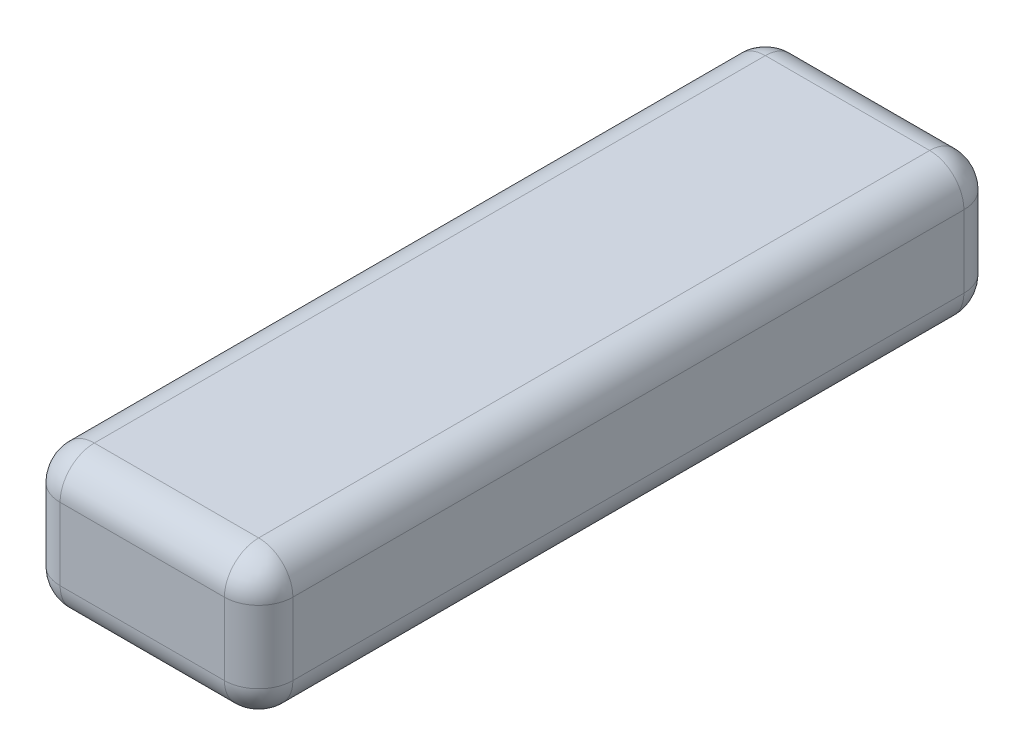
ISO-10303-21;
HEADER;
FILE_DESCRIPTION(('STEP AP214'),'2;1');
FILE_NAME('part.step','',(''),(''),'','','');
FILE_SCHEMA(('AUTOMOTIVE_DESIGN { 1 0 10303 214 1 1 1 1 }'));
ENDSEC;
DATA;
#1=APPLICATION_CONTEXT('core data for automotive mechanical design processes');
#2=APPLICATION_PROTOCOL_DEFINITION('international standard','automotive_design',2000,#1);
#3=PRODUCT_CONTEXT('',#1,'mechanical');
#4=PRODUCT('Part','Part','',(#3));
#5=PRODUCT_RELATED_PRODUCT_CATEGORY('part','',(#4));
#6=PRODUCT_DEFINITION_FORMATION('','',#4);
#7=PRODUCT_DEFINITION_CONTEXT('part definition',#1,'design');
#8=PRODUCT_DEFINITION('design','',#6,#7);
#9=PRODUCT_DEFINITION_SHAPE('','',#8);
#10=(LENGTH_UNIT() NAMED_UNIT(*) SI_UNIT(.MILLI.,.METRE.));
#11=(NAMED_UNIT(*) PLANE_ANGLE_UNIT() SI_UNIT($,.RADIAN.));
#12=(NAMED_UNIT(*) SI_UNIT($,.STERADIAN.) SOLID_ANGLE_UNIT());
#13=UNCERTAINTY_MEASURE_WITH_UNIT(LENGTH_MEASURE(1.E-05),#10,'distance_accuracy_value','');
#14=(GEOMETRIC_REPRESENTATION_CONTEXT(3) GLOBAL_UNCERTAINTY_ASSIGNED_CONTEXT((#13)) GLOBAL_UNIT_ASSIGNED_CONTEXT((#10,
#11,#12)) REPRESENTATION_CONTEXT('',''));
#15=CARTESIAN_POINT('',(0.,0.,0.));
#16=DIRECTION('',(0.,0.,1.));
#17=DIRECTION('',(1.,0.,0.));
#18=AXIS2_PLACEMENT_3D('',#15,#16,#17);
#19=CARTESIAN_POINT('',(17.,-10.05,54.));
#20=DIRECTION('',(1.,0.,0.));
#21=DIRECTION('',(0.,0.,-1.));
#22=AXIS2_PLACEMENT_3D('',#19,#20,#21);
#23=PLANE('',#22);
#24=DIRECTION('',(0.,1.,0.));
#25=VECTOR('',#24,1.);
#26=CARTESIAN_POINT('',(17.,-10.05,49.));
#27=LINE('',#26,#25);
#28=CARTESIAN_POINT('',(17.,5.5,49.));
#29=VERTEX_POINT('',#28);
#30=CARTESIAN_POINT('',(17.,-5.05,49.));
#31=VERTEX_POINT('',#30);
#32=EDGE_CURVE('E158',#29,#31,#27,.F.);
#33=ORIENTED_EDGE('',*,*,#32,.T.);
#34=DIRECTION('',(0.,0.,-1.));
#35=VECTOR('',#34,1.);
#36=CARTESIAN_POINT('',(17.,-5.05,54.));
#37=LINE('',#36,#35);
#38=CARTESIAN_POINT('',(17.,-5.05,-49.));
#39=VERTEX_POINT('',#38);
#40=EDGE_CURVE('E134',#31,#39,#37,.T.);
#41=ORIENTED_EDGE('',*,*,#40,.T.);
#42=DIRECTION('',(0.,1.,0.));
#43=VECTOR('',#42,1.);
#44=CARTESIAN_POINT('',(17.,-10.05,-49.));
#45=LINE('',#44,#43);
#46=CARTESIAN_POINT('',(17.,5.5,-49.));
#47=VERTEX_POINT('',#46);
#48=EDGE_CURVE('E155',#39,#47,#45,.T.);
#49=ORIENTED_EDGE('',*,*,#48,.T.);
#50=DIRECTION('',(0.,0.,-1.));
#51=VECTOR('',#50,1.);
#52=CARTESIAN_POINT('',(17.,5.5,49.));
#53=LINE('',#52,#51);
#54=EDGE_CURVE('E161',#47,#29,#53,.F.);
#55=ORIENTED_EDGE('',*,*,#54,.T.);
#56=EDGE_LOOP('',(#33,#41,#49,#55));
#57=FACE_BOUND('',#56,.T.);
#58=ADVANCED_FACE('F39',(#57),#23,.T.);
#59=CARTESIAN_POINT('',(-17.,-10.05,54.));
#60=DIRECTION('',(0.,0.,1.));
#61=DIRECTION('',(1.,0.,0.));
#62=AXIS2_PLACEMENT_3D('',#59,#60,#61);
#63=PLANE('',#62);
#64=DIRECTION('',(0.,1.,0.));
#65=VECTOR('',#64,1.);
#66=CARTESIAN_POINT('',(-12.,-10.05,54.));
#67=LINE('',#66,#65);
#68=CARTESIAN_POINT('',(-12.,5.5,54.));
#69=VERTEX_POINT('',#68);
#70=CARTESIAN_POINT('',(-12.,-5.05,54.));
#71=VERTEX_POINT('',#70);
#72=EDGE_CURVE('E183',#69,#71,#67,.F.);
#73=ORIENTED_EDGE('',*,*,#72,.T.);
#74=DIRECTION('',(1.,0.,0.));
#75=VECTOR('',#74,1.);
#76=CARTESIAN_POINT('',(-17.,-5.05,54.));
#77=LINE('',#76,#75);
#78=CARTESIAN_POINT('',(12.,-5.05,54.));
#79=VERTEX_POINT('',#78);
#80=EDGE_CURVE('E212',#71,#79,#77,.T.);
#81=ORIENTED_EDGE('',*,*,#80,.T.);
#82=DIRECTION('',(0.,1.,0.));
#83=VECTOR('',#82,1.);
#84=CARTESIAN_POINT('',(12.,-10.05,54.));
#85=LINE('',#84,#83);
#86=CARTESIAN_POINT('',(12.,5.5,54.));
#87=VERTEX_POINT('',#86);
#88=EDGE_CURVE('E180',#79,#87,#85,.T.);
#89=ORIENTED_EDGE('',*,*,#88,.T.);
#90=DIRECTION('',(1.,0.,0.));
#91=VECTOR('',#90,1.);
#92=CARTESIAN_POINT('',(-12.,5.5,54.));
#93=LINE('',#92,#91);
#94=EDGE_CURVE('E209',#87,#69,#93,.F.);
#95=ORIENTED_EDGE('',*,*,#94,.T.);
#96=EDGE_LOOP('',(#73,#81,#89,#95));
#97=FACE_BOUND('',#96,.T.);
#98=ADVANCED_FACE('F301',(#97),#63,.T.);
#99=CARTESIAN_POINT('',(-17.,-10.05,54.));
#100=DIRECTION('',(-1.,0.,0.));
#101=DIRECTION('',(0.,0.,1.));
#102=AXIS2_PLACEMENT_3D('',#99,#100,#101);
#103=PLANE('',#102);
#104=DIRECTION('',(0.,1.,0.));
#105=VECTOR('',#104,1.);
#106=CARTESIAN_POINT('',(-17.,-10.05,-49.));
#107=LINE('',#106,#105);
#108=CARTESIAN_POINT('',(-17.,5.5,-49.));
#109=VERTEX_POINT('',#108);
#110=CARTESIAN_POINT('',(-17.,-5.05,-49.));
#111=VERTEX_POINT('',#110);
#112=EDGE_CURVE('E177',#109,#111,#107,.F.);
#113=ORIENTED_EDGE('',*,*,#112,.T.);
#114=DIRECTION('',(0.,0.,1.));
#115=VECTOR('',#114,1.);
#116=CARTESIAN_POINT('',(-17.,-5.05,54.));
#117=LINE('',#116,#115);
#118=CARTESIAN_POINT('',(-17.,-5.05,49.));
#119=VERTEX_POINT('',#118);
#120=EDGE_CURVE('E203',#111,#119,#117,.T.);
#121=ORIENTED_EDGE('',*,*,#120,.T.);
#122=DIRECTION('',(0.,1.,0.));
#123=VECTOR('',#122,1.);
#124=CARTESIAN_POINT('',(-17.,-10.05,49.));
#125=LINE('',#124,#123);
#126=CARTESIAN_POINT('',(-17.,5.5,49.));
#127=VERTEX_POINT('',#126);
#128=EDGE_CURVE('E174',#119,#127,#125,.T.);
#129=ORIENTED_EDGE('',*,*,#128,.T.);
#130=DIRECTION('',(0.,0.,1.));
#131=VECTOR('',#130,1.);
#132=CARTESIAN_POINT('',(-17.,5.5,-49.));
#133=LINE('',#132,#131);
#134=EDGE_CURVE('E201',#127,#109,#133,.F.);
#135=ORIENTED_EDGE('',*,*,#134,.T.);
#136=EDGE_LOOP('',(#113,#121,#129,#135));
#137=FACE_BOUND('',#136,.T.);
#138=ADVANCED_FACE('F289',(#137),#103,.T.);
#139=CARTESIAN_POINT('',(-17.,-10.05,-54.));
#140=DIRECTION('',(0.,0.,-1.));
#141=DIRECTION('',(-1.,0.,0.));
#142=AXIS2_PLACEMENT_3D('',#139,#140,#141);
#143=PLANE('',#142);
#144=DIRECTION('',(0.,1.,0.));
#145=VECTOR('',#144,1.);
#146=CARTESIAN_POINT('',(12.,-10.05,-54.));
#147=LINE('',#146,#145);
#148=CARTESIAN_POINT('',(12.,5.5,-54.));
#149=VERTEX_POINT('',#148);
#150=CARTESIAN_POINT('',(12.,-5.05,-54.));
#151=VERTEX_POINT('',#150);
#152=EDGE_CURVE('E168',#149,#151,#147,.F.);
#153=ORIENTED_EDGE('',*,*,#152,.T.);
#154=DIRECTION('',(-1.,0.,0.));
#155=VECTOR('',#154,1.);
#156=CARTESIAN_POINT('',(-17.,-5.05,-54.));
#157=LINE('',#156,#155);
#158=CARTESIAN_POINT('',(-12.,-5.05,-54.));
#159=VERTEX_POINT('',#158);
#160=EDGE_CURVE('E195',#151,#159,#157,.T.);
#161=ORIENTED_EDGE('',*,*,#160,.T.);
#162=DIRECTION('',(0.,1.,0.));
#163=VECTOR('',#162,1.);
#164=CARTESIAN_POINT('',(-12.,-10.05,-54.));
#165=LINE('',#164,#163);
#166=CARTESIAN_POINT('',(-12.,5.5,-54.));
#167=VERTEX_POINT('',#166);
#168=EDGE_CURVE('E165',#159,#167,#165,.T.);
#169=ORIENTED_EDGE('',*,*,#168,.T.);
#170=DIRECTION('',(-1.,0.,0.));
#171=VECTOR('',#170,1.);
#172=CARTESIAN_POINT('',(12.,5.5,-54.));
#173=LINE('',#172,#171);
#174=EDGE_CURVE('E149',#167,#149,#173,.F.);
#175=ORIENTED_EDGE('',*,*,#174,.T.);
#176=EDGE_LOOP('',(#153,#161,#169,#175));
#177=FACE_BOUND('',#176,.T.);
#178=ADVANCED_FACE('F264',(#177),#143,.T.);
#179=CARTESIAN_POINT('',(0.,-10.05,0.));
#180=DIRECTION('',(0.,-1.,0.));
#181=DIRECTION('',(0.,0.,-1.));
#182=AXIS2_PLACEMENT_3D('',#179,#180,#181);
#183=PLANE('',#182);
#184=DIRECTION('',(-1.,0.,0.));
#185=VECTOR('',#184,1.);
#186=CARTESIAN_POINT('',(0.,-10.05,-49.));
#187=LINE('',#186,#185);
#188=CARTESIAN_POINT('',(-12.,-10.05,-49.));
#189=VERTEX_POINT('',#188);
#190=CARTESIAN_POINT('',(12.,-10.05,-49.));
#191=VERTEX_POINT('',#190);
#192=EDGE_CURVE('E190',#189,#191,#187,.F.);
#193=ORIENTED_EDGE('',*,*,#192,.T.);
#194=DIRECTION('',(0.,0.,-1.));
#195=VECTOR('',#194,1.);
#196=CARTESIAN_POINT('',(12.,-10.05,0.));
#197=LINE('',#196,#195);
#198=CARTESIAN_POINT('',(12.,-10.05,49.));
#199=VERTEX_POINT('',#198);
#200=EDGE_CURVE('E136',#191,#199,#197,.F.);
#201=ORIENTED_EDGE('',*,*,#200,.T.);
#202=DIRECTION('',(1.,0.,0.));
#203=VECTOR('',#202,1.);
#204=CARTESIAN_POINT('',(0.,-10.05,49.));
#205=LINE('',#204,#203);
#206=CARTESIAN_POINT('',(-12.,-10.05,49.));
#207=VERTEX_POINT('',#206);
#208=EDGE_CURVE('E160',#199,#207,#205,.F.);
#209=ORIENTED_EDGE('',*,*,#208,.T.);
#210=DIRECTION('',(0.,0.,1.));
#211=VECTOR('',#210,1.);
#212=CARTESIAN_POINT('',(-12.,-10.05,0.));
#213=LINE('',#212,#211);
#214=EDGE_CURVE('E188',#207,#189,#213,.F.);
#215=ORIENTED_EDGE('',*,*,#214,.T.);
#216=EDGE_LOOP('',(#193,#201,#209,#215));
#217=FACE_BOUND('',#216,.T.);
#218=ADVANCED_FACE('F279',(#217),#183,.T.);
#219=CARTESIAN_POINT('',(0.,10.5,0.));
#220=DIRECTION('',(0.,-1.,0.));
#221=DIRECTION('',(0.,0.,-1.));
#222=AXIS2_PLACEMENT_3D('',#219,#220,#221);
#223=PLANE('',#222);
#224=DIRECTION('',(0.,0.,1.));
#225=VECTOR('',#224,1.);
#226=CARTESIAN_POINT('',(-12.,10.5,49.));
#227=LINE('',#226,#225);
#228=CARTESIAN_POINT('',(-12.,10.5,-49.));
#229=VERTEX_POINT('',#228);
#230=CARTESIAN_POINT('',(-12.,10.5,49.));
#231=VERTEX_POINT('',#230);
#232=EDGE_CURVE('E56',#229,#231,#227,.T.);
#233=ORIENTED_EDGE('',*,*,#232,.T.);
#234=DIRECTION('',(1.,0.,0.));
#235=VECTOR('',#234,1.);
#236=CARTESIAN_POINT('',(12.,10.5,49.));
#237=LINE('',#236,#235);
#238=CARTESIAN_POINT('',(12.,10.5,49.));
#239=VERTEX_POINT('',#238);
#240=EDGE_CURVE('E218',#231,#239,#237,.T.);
#241=ORIENTED_EDGE('',*,*,#240,.T.);
#242=DIRECTION('',(0.,0.,-1.));
#243=VECTOR('',#242,1.);
#244=CARTESIAN_POINT('',(12.,10.5,-49.));
#245=LINE('',#244,#243);
#246=CARTESIAN_POINT('',(12.,10.5,-49.));
#247=VERTEX_POINT('',#246);
#248=EDGE_CURVE('E214',#239,#247,#245,.T.);
#249=ORIENTED_EDGE('',*,*,#248,.T.);
#250=DIRECTION('',(-1.,0.,0.));
#251=VECTOR('',#250,1.);
#252=CARTESIAN_POINT('',(-12.,10.5,-49.));
#253=LINE('',#252,#251);
#254=EDGE_CURVE('E61',#247,#229,#253,.T.);
#255=ORIENTED_EDGE('',*,*,#254,.T.);
#256=EDGE_LOOP('',(#233,#241,#249,#255));
#257=FACE_BOUND('',#256,.T.);
#258=ADVANCED_FACE('F315',(#257),#223,.F.);
#259=CARTESIAN_POINT('',(12.,-10.05,-49.));
#260=DIRECTION('',(0.,1.,0.));
#261=DIRECTION('',(0.,0.,1.));
#262=AXIS2_PLACEMENT_3D('',#259,#260,#261);
#263=CYLINDRICAL_SURFACE('',#262,5.);
#264=ORIENTED_EDGE('',*,*,#48,.F.);
#265=CARTESIAN_POINT('',(12.,-5.05,-49.));
#266=DIRECTION('',(0.,1.,0.));
#267=DIRECTION('',(0.,0.,1.));
#268=AXIS2_PLACEMENT_3D('',#265,#266,#267);
#269=CIRCLE('',#268,5.);
#270=EDGE_CURVE('E141',#39,#151,#269,.T.);
#271=ORIENTED_EDGE('',*,*,#270,.T.);
#272=ORIENTED_EDGE('',*,*,#152,.F.);
#273=CARTESIAN_POINT('',(12.,5.5,-49.));
#274=DIRECTION('',(0.,1.,0.));
#275=DIRECTION('',(0.,0.,1.));
#276=AXIS2_PLACEMENT_3D('',#273,#274,#275);
#277=CIRCLE('',#276,5.);
#278=EDGE_CURVE('E150',#149,#47,#277,.F.);
#279=ORIENTED_EDGE('',*,*,#278,.T.);
#280=EDGE_LOOP('',(#264,#271,#272,#279));
#281=FACE_BOUND('',#280,.T.);
#282=ADVANCED_FACE('F163',(#281),#263,.T.);
#283=CARTESIAN_POINT('',(-12.,-10.05,-49.));
#284=DIRECTION('',(0.,1.,0.));
#285=DIRECTION('',(0.,0.,1.));
#286=AXIS2_PLACEMENT_3D('',#283,#284,#285);
#287=CYLINDRICAL_SURFACE('',#286,5.);
#288=ORIENTED_EDGE('',*,*,#168,.F.);
#289=CARTESIAN_POINT('',(-12.,-5.05,-49.));
#290=DIRECTION('',(0.,1.,0.));
#291=DIRECTION('',(0.,0.,1.));
#292=AXIS2_PLACEMENT_3D('',#289,#290,#291);
#293=CIRCLE('',#292,5.);
#294=EDGE_CURVE('E199',#159,#111,#293,.T.);
#295=ORIENTED_EDGE('',*,*,#294,.T.);
#296=ORIENTED_EDGE('',*,*,#112,.F.);
#297=CARTESIAN_POINT('',(-12.,5.5,-49.));
#298=DIRECTION('',(0.,1.,0.));
#299=DIRECTION('',(0.,0.,1.));
#300=AXIS2_PLACEMENT_3D('',#297,#298,#299);
#301=CIRCLE('',#300,5.);
#302=EDGE_CURVE('E197',#109,#167,#301,.F.);
#303=ORIENTED_EDGE('',*,*,#302,.T.);
#304=EDGE_LOOP('',(#288,#295,#296,#303));
#305=FACE_BOUND('',#304,.T.);
#306=ADVANCED_FACE('F269',(#305),#287,.T.);
#307=CARTESIAN_POINT('',(-12.,-10.05,49.));
#308=DIRECTION('',(0.,1.,0.));
#309=DIRECTION('',(0.,0.,1.));
#310=AXIS2_PLACEMENT_3D('',#307,#308,#309);
#311=CYLINDRICAL_SURFACE('',#310,5.);
#312=ORIENTED_EDGE('',*,*,#128,.F.);
#313=CARTESIAN_POINT('',(-12.,-5.05,49.));
#314=DIRECTION('',(0.,1.,0.));
#315=DIRECTION('',(0.,0.,1.));
#316=AXIS2_PLACEMENT_3D('',#313,#314,#315);
#317=CIRCLE('',#316,5.);
#318=EDGE_CURVE('E207',#119,#71,#317,.T.);
#319=ORIENTED_EDGE('',*,*,#318,.T.);
#320=ORIENTED_EDGE('',*,*,#72,.F.);
#321=CARTESIAN_POINT('',(-12.,5.5,49.));
#322=DIRECTION('',(0.,1.,0.));
#323=DIRECTION('',(0.,0.,1.));
#324=AXIS2_PLACEMENT_3D('',#321,#322,#323);
#325=CIRCLE('',#324,5.);
#326=EDGE_CURVE('E205',#69,#127,#325,.F.);
#327=ORIENTED_EDGE('',*,*,#326,.T.);
#328=EDGE_LOOP('',(#312,#319,#320,#327));
#329=FACE_BOUND('',#328,.T.);
#330=ADVANCED_FACE('F292',(#329),#311,.T.);
#331=CARTESIAN_POINT('',(12.,-10.05,49.));
#332=DIRECTION('',(0.,1.,0.));
#333=DIRECTION('',(0.,0.,1.));
#334=AXIS2_PLACEMENT_3D('',#331,#332,#333);
#335=CYLINDRICAL_SURFACE('',#334,5.);
#336=ORIENTED_EDGE('',*,*,#88,.F.);
#337=CARTESIAN_POINT('',(12.,-5.05,49.));
#338=DIRECTION('',(0.,1.,0.));
#339=DIRECTION('',(0.,0.,1.));
#340=AXIS2_PLACEMENT_3D('',#337,#338,#339);
#341=CIRCLE('',#340,5.);
#342=EDGE_CURVE('E11',#79,#31,#341,.T.);
#343=ORIENTED_EDGE('',*,*,#342,.T.);
#344=ORIENTED_EDGE('',*,*,#32,.F.);
#345=CARTESIAN_POINT('',(12.,5.5,49.));
#346=DIRECTION('',(0.,1.,0.));
#347=DIRECTION('',(0.,0.,1.));
#348=AXIS2_PLACEMENT_3D('',#345,#346,#347);
#349=CIRCLE('',#348,5.);
#350=EDGE_CURVE('E48',#29,#87,#349,.F.);
#351=ORIENTED_EDGE('',*,*,#350,.T.);
#352=EDGE_LOOP('',(#336,#343,#344,#351));
#353=FACE_BOUND('',#352,.T.);
#354=ADVANCED_FACE('F337',(#353),#335,.T.);
#355=CARTESIAN_POINT('',(-12.,-5.05,54.));
#356=DIRECTION('',(0.,0.,1.));
#357=DIRECTION('',(1.,0.,0.));
#358=AXIS2_PLACEMENT_3D('',#355,#356,#357);
#359=CYLINDRICAL_SURFACE('',#358,5.);
#360=CARTESIAN_POINT('',(-12.,-5.05,49.));
#361=DIRECTION('',(0.,0.,1.));
#362=DIRECTION('',(1.,0.,0.));
#363=AXIS2_PLACEMENT_3D('',#360,#361,#362);
#364=CIRCLE('',#363,5.);
#365=EDGE_CURVE('E170',#119,#207,#364,.T.);
#366=ORIENTED_EDGE('',*,*,#365,.F.);
#367=ORIENTED_EDGE('',*,*,#120,.F.);
#368=CARTESIAN_POINT('',(-12.,-5.05,-49.));
#369=DIRECTION('',(0.,0.,-1.));
#370=DIRECTION('',(-1.,0.,0.));
#371=AXIS2_PLACEMENT_3D('',#368,#369,#370);
#372=CIRCLE('',#371,5.);
#373=EDGE_CURVE('E232',#189,#111,#372,.T.);
#374=ORIENTED_EDGE('',*,*,#373,.F.);
#375=ORIENTED_EDGE('',*,*,#214,.F.);
#376=EDGE_LOOP('',(#366,#367,#374,#375));
#377=FACE_BOUND('',#376,.T.);
#378=ADVANCED_FACE('F285',(#377),#359,.T.);
#379=CARTESIAN_POINT('',(-12.,-5.05,49.));
#380=DIRECTION('',(0.,-1.,0.));
#381=DIRECTION('',(0.,0.,-1.));
#382=AXIS2_PLACEMENT_3D('',#379,#380,#381);
#383=SPHERICAL_SURFACE('',#382,5.);
#384=ORIENTED_EDGE('',*,*,#318,.F.);
#385=ORIENTED_EDGE('',*,*,#365,.T.);
#386=CARTESIAN_POINT('',(-12.,-5.05,49.));
#387=DIRECTION('',(1.,0.,0.));
#388=DIRECTION('',(0.,0.,-1.));
#389=AXIS2_PLACEMENT_3D('',#386,#387,#388);
#390=CIRCLE('',#389,5.);
#391=EDGE_CURVE('E229',#71,#207,#390,.T.);
#392=ORIENTED_EDGE('',*,*,#391,.F.);
#393=EDGE_LOOP('',(#384,#385,#392));
#394=FACE_BOUND('',#393,.T.);
#395=ADVANCED_FACE('F357',(#394),#383,.T.);
#396=CARTESIAN_POINT('',(-12.,-5.05,-49.));
#397=DIRECTION('',(0.,-1.,0.));
#398=DIRECTION('',(0.,0.,-1.));
#399=AXIS2_PLACEMENT_3D('',#396,#397,#398);
#400=SPHERICAL_SURFACE('',#399,5.);
#401=ORIENTED_EDGE('',*,*,#373,.T.);
#402=ORIENTED_EDGE('',*,*,#294,.F.);
#403=CARTESIAN_POINT('',(-12.,-5.05,-49.));
#404=DIRECTION('',(1.,0.,0.));
#405=DIRECTION('',(0.,0.,-1.));
#406=AXIS2_PLACEMENT_3D('',#403,#404,#405);
#407=CIRCLE('',#406,5.);
#408=EDGE_CURVE('E226',#189,#159,#407,.T.);
#409=ORIENTED_EDGE('',*,*,#408,.F.);
#410=EDGE_LOOP('',(#401,#402,#409));
#411=FACE_BOUND('',#410,.T.);
#412=ADVANCED_FACE('F273',(#411),#400,.T.);
#413=CARTESIAN_POINT('',(-17.,-5.05,49.));
#414=DIRECTION('',(1.,0.,0.));
#415=DIRECTION('',(0.,0.,-1.));
#416=AXIS2_PLACEMENT_3D('',#413,#414,#415);
#417=CYLINDRICAL_SURFACE('',#416,5.);
#418=ORIENTED_EDGE('',*,*,#391,.T.);
#419=ORIENTED_EDGE('',*,*,#208,.F.);
#420=CARTESIAN_POINT('',(12.,-5.05,49.));
#421=DIRECTION('',(1.,0.,0.));
#422=DIRECTION('',(0.,0.,-1.));
#423=AXIS2_PLACEMENT_3D('',#420,#421,#422);
#424=CIRCLE('',#423,5.);
#425=EDGE_CURVE('E223',#79,#199,#424,.T.);
#426=ORIENTED_EDGE('',*,*,#425,.F.);
#427=ORIENTED_EDGE('',*,*,#80,.F.);
#428=EDGE_LOOP('',(#418,#419,#426,#427));
#429=FACE_BOUND('',#428,.T.);
#430=ADVANCED_FACE('F351',(#429),#417,.T.);
#431=CARTESIAN_POINT('',(-17.,-5.05,-49.));
#432=DIRECTION('',(-1.,0.,0.));
#433=DIRECTION('',(0.,0.,1.));
#434=AXIS2_PLACEMENT_3D('',#431,#432,#433);
#435=CYLINDRICAL_SURFACE('',#434,5.);
#436=ORIENTED_EDGE('',*,*,#408,.T.);
#437=ORIENTED_EDGE('',*,*,#160,.F.);
#438=CARTESIAN_POINT('',(12.,-5.05,-49.));
#439=DIRECTION('',(1.,0.,0.));
#440=DIRECTION('',(0.,0.,-1.));
#441=AXIS2_PLACEMENT_3D('',#438,#439,#440);
#442=CIRCLE('',#441,5.);
#443=EDGE_CURVE('E144',#191,#151,#442,.T.);
#444=ORIENTED_EDGE('',*,*,#443,.F.);
#445=ORIENTED_EDGE('',*,*,#192,.F.);
#446=EDGE_LOOP('',(#436,#437,#444,#445));
#447=FACE_BOUND('',#446,.T.);
#448=ADVANCED_FACE('F277',(#447),#435,.T.);
#449=CARTESIAN_POINT('',(12.,-5.05,49.));
#450=DIRECTION('',(0.,-1.,0.));
#451=DIRECTION('',(0.,0.,-1.));
#452=AXIS2_PLACEMENT_3D('',#449,#450,#451);
#453=SPHERICAL_SURFACE('',#452,5.);
#454=ORIENTED_EDGE('',*,*,#342,.F.);
#455=ORIENTED_EDGE('',*,*,#425,.T.);
#456=CARTESIAN_POINT('',(12.,-5.05,49.));
#457=DIRECTION('',(0.,0.,-1.));
#458=DIRECTION('',(-1.,0.,0.));
#459=AXIS2_PLACEMENT_3D('',#456,#457,#458);
#460=CIRCLE('',#459,5.);
#461=EDGE_CURVE('E139',#31,#199,#460,.T.);
#462=ORIENTED_EDGE('',*,*,#461,.F.);
#463=EDGE_LOOP('',(#454,#455,#462));
#464=FACE_BOUND('',#463,.T.);
#465=ADVANCED_FACE('F345',(#464),#453,.T.);
#466=CARTESIAN_POINT('',(12.,-5.05,-49.));
#467=DIRECTION('',(0.,-1.,0.));
#468=DIRECTION('',(0.,0.,-1.));
#469=AXIS2_PLACEMENT_3D('',#466,#467,#468);
#470=SPHERICAL_SURFACE('',#469,5.);
#471=ORIENTED_EDGE('',*,*,#443,.T.);
#472=ORIENTED_EDGE('',*,*,#270,.F.);
#473=CARTESIAN_POINT('',(12.,-5.05,-49.));
#474=DIRECTION('',(0.,0.,1.));
#475=DIRECTION('',(1.,0.,0.));
#476=AXIS2_PLACEMENT_3D('',#473,#474,#475);
#477=CIRCLE('',#476,5.);
#478=EDGE_CURVE('E130',#191,#39,#477,.T.);
#479=ORIENTED_EDGE('',*,*,#478,.F.);
#480=EDGE_LOOP('',(#471,#472,#479));
#481=FACE_BOUND('',#480,.T.);
#482=ADVANCED_FACE('F142',(#481),#470,.T.);
#483=CARTESIAN_POINT('',(12.,-5.05,54.));
#484=DIRECTION('',(0.,0.,-1.));
#485=DIRECTION('',(-1.,0.,0.));
#486=AXIS2_PLACEMENT_3D('',#483,#484,#485);
#487=CYLINDRICAL_SURFACE('',#486,5.);
#488=ORIENTED_EDGE('',*,*,#461,.T.);
#489=ORIENTED_EDGE('',*,*,#200,.F.);
#490=ORIENTED_EDGE('',*,*,#478,.T.);
#491=ORIENTED_EDGE('',*,*,#40,.F.);
#492=EDGE_LOOP('',(#488,#489,#490,#491));
#493=FACE_BOUND('',#492,.T.);
#494=ADVANCED_FACE('F132',(#493),#487,.T.);
#495=CARTESIAN_POINT('',(0.,5.5,-49.));
#496=DIRECTION('',(1.,0.,0.));
#497=DIRECTION('',(0.,0.,-1.));
#498=AXIS2_PLACEMENT_3D('',#495,#496,#497);
#499=CYLINDRICAL_SURFACE('',#498,5.);
#500=CARTESIAN_POINT('',(12.,5.5,-49.));
#501=DIRECTION('',(1.,0.,0.));
#502=DIRECTION('',(0.,0.,-1.));
#503=AXIS2_PLACEMENT_3D('',#500,#501,#502);
#504=CIRCLE('',#503,5.);
#505=EDGE_CURVE('E252',#149,#247,#504,.T.);
#506=ORIENTED_EDGE('',*,*,#505,.F.);
#507=ORIENTED_EDGE('',*,*,#174,.F.);
#508=CARTESIAN_POINT('',(-12.,5.5,-49.));
#509=DIRECTION('',(-1.,0.,0.));
#510=DIRECTION('',(0.,0.,1.));
#511=AXIS2_PLACEMENT_3D('',#508,#509,#510);
#512=CIRCLE('',#511,5.);
#513=EDGE_CURVE('E43',#229,#167,#512,.T.);
#514=ORIENTED_EDGE('',*,*,#513,.F.);
#515=ORIENTED_EDGE('',*,*,#254,.F.);
#516=EDGE_LOOP('',(#506,#507,#514,#515));
#517=FACE_BOUND('',#516,.T.);
#518=ADVANCED_FACE('F41',(#517),#499,.T.);
#519=CARTESIAN_POINT('',(-12.,5.5,-49.));
#520=DIRECTION('',(0.,-1.,0.));
#521=DIRECTION('',(0.,0.,-1.));
#522=AXIS2_PLACEMENT_3D('',#519,#520,#521);
#523=SPHERICAL_SURFACE('',#522,5.);
#524=ORIENTED_EDGE('',*,*,#513,.T.);
#525=ORIENTED_EDGE('',*,*,#302,.F.);
#526=CARTESIAN_POINT('',(-12.,5.5,-49.));
#527=DIRECTION('',(0.,0.,1.));
#528=DIRECTION('',(1.,0.,0.));
#529=AXIS2_PLACEMENT_3D('',#526,#527,#528);
#530=CIRCLE('',#529,5.);
#531=EDGE_CURVE('E250',#229,#109,#530,.T.);
#532=ORIENTED_EDGE('',*,*,#531,.F.);
#533=EDGE_LOOP('',(#524,#525,#532));
#534=FACE_BOUND('',#533,.T.);
#535=ADVANCED_FACE('F260',(#534),#523,.T.);
#536=CARTESIAN_POINT('',(12.,5.5,-49.));
#537=DIRECTION('',(0.,-1.,0.));
#538=DIRECTION('',(0.,0.,-1.));
#539=AXIS2_PLACEMENT_3D('',#536,#537,#538);
#540=SPHERICAL_SURFACE('',#539,5.);
#541=ORIENTED_EDGE('',*,*,#278,.F.);
#542=ORIENTED_EDGE('',*,*,#505,.T.);
#543=CARTESIAN_POINT('',(12.,5.5,-49.));
#544=DIRECTION('',(0.,0.,1.));
#545=DIRECTION('',(1.,0.,0.));
#546=AXIS2_PLACEMENT_3D('',#543,#544,#545);
#547=CIRCLE('',#546,5.);
#548=EDGE_CURVE('E247',#47,#247,#547,.T.);
#549=ORIENTED_EDGE('',*,*,#548,.F.);
#550=EDGE_LOOP('',(#541,#542,#549));
#551=FACE_BOUND('',#550,.T.);
#552=ADVANCED_FACE('F374',(#551),#540,.T.);
#553=CARTESIAN_POINT('',(-12.,5.5,0.));
#554=DIRECTION('',(0.,0.,-1.));
#555=DIRECTION('',(-1.,0.,0.));
#556=AXIS2_PLACEMENT_3D('',#553,#554,#555);
#557=CYLINDRICAL_SURFACE('',#556,5.);
#558=ORIENTED_EDGE('',*,*,#531,.T.);
#559=ORIENTED_EDGE('',*,*,#134,.F.);
#560=CARTESIAN_POINT('',(-12.,5.5,49.));
#561=DIRECTION('',(0.,0.,1.));
#562=DIRECTION('',(1.,0.,0.));
#563=AXIS2_PLACEMENT_3D('',#560,#561,#562);
#564=CIRCLE('',#563,5.);
#565=EDGE_CURVE('E244',#231,#127,#564,.T.);
#566=ORIENTED_EDGE('',*,*,#565,.F.);
#567=ORIENTED_EDGE('',*,*,#232,.F.);
#568=EDGE_LOOP('',(#558,#559,#566,#567));
#569=FACE_BOUND('',#568,.T.);
#570=ADVANCED_FACE('F371',(#569),#557,.T.);
#571=CARTESIAN_POINT('',(12.,5.5,0.));
#572=DIRECTION('',(0.,0.,1.));
#573=DIRECTION('',(1.,0.,0.));
#574=AXIS2_PLACEMENT_3D('',#571,#572,#573);
#575=CYLINDRICAL_SURFACE('',#574,5.);
#576=ORIENTED_EDGE('',*,*,#548,.T.);
#577=ORIENTED_EDGE('',*,*,#248,.F.);
#578=CARTESIAN_POINT('',(12.,5.5,49.));
#579=DIRECTION('',(0.,0.,1.));
#580=DIRECTION('',(1.,0.,0.));
#581=AXIS2_PLACEMENT_3D('',#578,#579,#580);
#582=CIRCLE('',#581,5.);
#583=EDGE_CURVE('E241',#29,#239,#582,.T.);
#584=ORIENTED_EDGE('',*,*,#583,.F.);
#585=ORIENTED_EDGE('',*,*,#54,.F.);
#586=EDGE_LOOP('',(#576,#577,#584,#585));
#587=FACE_BOUND('',#586,.T.);
#588=ADVANCED_FACE('F314',(#587),#575,.T.);
#589=CARTESIAN_POINT('',(-12.,5.5,49.));
#590=DIRECTION('',(0.,-1.,0.));
#591=DIRECTION('',(0.,0.,-1.));
#592=AXIS2_PLACEMENT_3D('',#589,#590,#591);
#593=SPHERICAL_SURFACE('',#592,5.);
#594=ORIENTED_EDGE('',*,*,#565,.T.);
#595=ORIENTED_EDGE('',*,*,#326,.F.);
#596=CARTESIAN_POINT('',(-12.,5.5,49.));
#597=DIRECTION('',(1.,0.,0.));
#598=DIRECTION('',(0.,0.,-1.));
#599=AXIS2_PLACEMENT_3D('',#596,#597,#598);
#600=CIRCLE('',#599,5.);
#601=EDGE_CURVE('E239',#231,#69,#600,.T.);
#602=ORIENTED_EDGE('',*,*,#601,.F.);
#603=EDGE_LOOP('',(#594,#595,#602));
#604=FACE_BOUND('',#603,.T.);
#605=ADVANCED_FACE('F297',(#604),#593,.T.);
#606=CARTESIAN_POINT('',(12.,5.5,49.));
#607=DIRECTION('',(0.,-1.,0.));
#608=DIRECTION('',(0.,0.,-1.));
#609=AXIS2_PLACEMENT_3D('',#606,#607,#608);
#610=SPHERICAL_SURFACE('',#609,5.);
#611=ORIENTED_EDGE('',*,*,#350,.F.);
#612=ORIENTED_EDGE('',*,*,#583,.T.);
#613=CARTESIAN_POINT('',(12.,5.5,49.));
#614=DIRECTION('',(-1.,0.,0.));
#615=DIRECTION('',(0.,0.,1.));
#616=AXIS2_PLACEMENT_3D('',#613,#614,#615);
#617=CIRCLE('',#616,5.);
#618=EDGE_CURVE('E237',#87,#239,#617,.T.);
#619=ORIENTED_EDGE('',*,*,#618,.F.);
#620=EDGE_LOOP('',(#611,#612,#619));
#621=FACE_BOUND('',#620,.T.);
#622=ADVANCED_FACE('F309',(#621),#610,.T.);
#623=CARTESIAN_POINT('',(0.,5.5,49.));
#624=DIRECTION('',(-1.,0.,0.));
#625=DIRECTION('',(0.,0.,1.));
#626=AXIS2_PLACEMENT_3D('',#623,#624,#625);
#627=CYLINDRICAL_SURFACE('',#626,5.);
#628=ORIENTED_EDGE('',*,*,#601,.T.);
#629=ORIENTED_EDGE('',*,*,#94,.F.);
#630=ORIENTED_EDGE('',*,*,#618,.T.);
#631=ORIENTED_EDGE('',*,*,#240,.F.);
#632=EDGE_LOOP('',(#628,#629,#630,#631));
#633=FACE_BOUND('',#632,.T.);
#634=ADVANCED_FACE('F306',(#633),#627,.T.);
#635=CLOSED_SHELL('',(#58,#98,#138,#178,#218,#258,#282,#306,#330,#354,#378,#395,#412,#430,#448,
#465,#482,#494,#518,#535,#552,#570,#588,#605,#622,#634));
#636=MANIFOLD_SOLID_BREP('B2',#635);
#637=ADVANCED_BREP_SHAPE_REPRESENTATION('',(#18,#636),#14);
#638=SHAPE_DEFINITION_REPRESENTATION(#9,#637);
ENDSEC;
END-ISO-10303-21;
